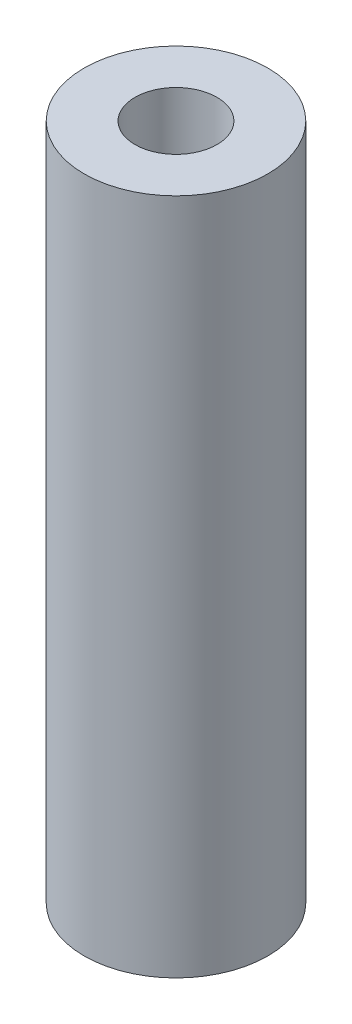
ISO-10303-21;
HEADER;
FILE_DESCRIPTION(('STEP AP214'),'2;1');
FILE_NAME('part.step','',(''),(''),'','','');
FILE_SCHEMA(('AUTOMOTIVE_DESIGN { 1 0 10303 214 1 1 1 1 }'));
ENDSEC;
DATA;
#1=APPLICATION_CONTEXT('core data for automotive mechanical design processes');
#2=APPLICATION_PROTOCOL_DEFINITION('international standard','automotive_design',2000,#1);
#3=PRODUCT_CONTEXT('',#1,'mechanical');
#4=PRODUCT('Part','Part','',(#3));
#5=PRODUCT_RELATED_PRODUCT_CATEGORY('part','',(#4));
#6=PRODUCT_DEFINITION_FORMATION('','',#4);
#7=PRODUCT_DEFINITION_CONTEXT('part definition',#1,'design');
#8=PRODUCT_DEFINITION('design','',#6,#7);
#9=PRODUCT_DEFINITION_SHAPE('','',#8);
#10=(LENGTH_UNIT() NAMED_UNIT(*) SI_UNIT(.MILLI.,.METRE.));
#11=(NAMED_UNIT(*) PLANE_ANGLE_UNIT() SI_UNIT($,.RADIAN.));
#12=(NAMED_UNIT(*) SI_UNIT($,.STERADIAN.) SOLID_ANGLE_UNIT());
#13=UNCERTAINTY_MEASURE_WITH_UNIT(LENGTH_MEASURE(1.E-05),#10,'distance_accuracy_value','');
#14=(GEOMETRIC_REPRESENTATION_CONTEXT(3) GLOBAL_UNCERTAINTY_ASSIGNED_CONTEXT((#13)) GLOBAL_UNIT_ASSIGNED_CONTEXT((#10,
#11,#12)) REPRESENTATION_CONTEXT('',''));
#15=CARTESIAN_POINT('',(0.,0.,0.));
#16=DIRECTION('',(0.,0.,1.));
#17=DIRECTION('',(1.,0.,0.));
#18=AXIS2_PLACEMENT_3D('',#15,#16,#17);
#19=CARTESIAN_POINT('',(0.,80.,0.));
#20=DIRECTION('',(0.,1.,0.));
#21=DIRECTION('',(0.,0.,1.));
#22=AXIS2_PLACEMENT_3D('',#19,#20,#21);
#23=PLANE('',#22);
#24=CARTESIAN_POINT('',(0.,80.,0.));
#25=DIRECTION('',(0.,1.,0.));
#26=DIRECTION('',(0.,0.,1.));
#27=AXIS2_PLACEMENT_3D('',#24,#25,#26);
#28=CIRCLE('',#27,10.8404002201047);
#29=CARTESIAN_POINT('',(0.,80.,10.8404002201047));
#30=VERTEX_POINT('',#29);
#31=EDGE_CURVE('E10',#30,#30,#28,.T.);
#32=ORIENTED_EDGE('',*,*,#31,.T.);
#33=EDGE_LOOP('',(#32));
#34=FACE_BOUND('',#33,.T.);
#35=CARTESIAN_POINT('',(0.,80.,0.));
#36=DIRECTION('',(0.,1.,0.));
#37=DIRECTION('',(0.,0.,1.));
#38=AXIS2_PLACEMENT_3D('',#35,#36,#37);
#39=CIRCLE('',#38,4.84040022010471);
#40=CARTESIAN_POINT('',(0.,80.,4.84040022010471));
#41=VERTEX_POINT('',#40);
#42=EDGE_CURVE('E41',#41,#41,#39,.T.);
#43=ORIENTED_EDGE('',*,*,#42,.F.);
#44=EDGE_LOOP('',(#43));
#45=FACE_BOUND('',#44,.T.);
#46=ADVANCED_FACE('F30',(#34,#45),#23,.T.);
#47=CARTESIAN_POINT('',(0.,0.,0.));
#48=DIRECTION('',(0.,1.,0.));
#49=DIRECTION('',(0.,0.,1.));
#50=AXIS2_PLACEMENT_3D('',#47,#48,#49);
#51=PLANE('',#50);
#52=CARTESIAN_POINT('',(0.,0.,0.));
#53=DIRECTION('',(0.,1.,0.));
#54=DIRECTION('',(0.,0.,1.));
#55=AXIS2_PLACEMENT_3D('',#52,#53,#54);
#56=CIRCLE('',#55,10.8404002201047);
#57=CARTESIAN_POINT('',(0.,0.,10.8404002201047));
#58=VERTEX_POINT('',#57);
#59=EDGE_CURVE('E34',#58,#58,#56,.T.);
#60=ORIENTED_EDGE('',*,*,#59,.F.);
#61=EDGE_LOOP('',(#60));
#62=FACE_BOUND('',#61,.T.);
#63=CARTESIAN_POINT('',(0.,0.,0.));
#64=DIRECTION('',(0.,1.,0.));
#65=DIRECTION('',(0.,0.,1.));
#66=AXIS2_PLACEMENT_3D('',#63,#64,#65);
#67=CIRCLE('',#66,4.84040022010471);
#68=CARTESIAN_POINT('',(0.,0.,4.84040022010471));
#69=VERTEX_POINT('',#68);
#70=EDGE_CURVE('E43',#69,#69,#67,.T.);
#71=ORIENTED_EDGE('',*,*,#70,.T.);
#72=EDGE_LOOP('',(#71));
#73=FACE_BOUND('',#72,.T.);
#74=ADVANCED_FACE('F53',(#62,#73),#51,.F.);
#75=CARTESIAN_POINT('',(0.,80.,0.));
#76=DIRECTION('',(0.,-1.,0.));
#77=DIRECTION('',(0.,0.,-1.));
#78=AXIS2_PLACEMENT_3D('',#75,#76,#77);
#79=CYLINDRICAL_SURFACE('',#78,10.8404002201047);
#80=ORIENTED_EDGE('',*,*,#31,.F.);
#81=EDGE_LOOP('',(#80));
#82=FACE_BOUND('',#81,.T.);
#83=ORIENTED_EDGE('',*,*,#59,.T.);
#84=EDGE_LOOP('',(#83));
#85=FACE_BOUND('',#84,.T.);
#86=ADVANCED_FACE('F32',(#82,#85),#79,.T.);
#87=CARTESIAN_POINT('',(0.,80.,0.));
#88=DIRECTION('',(0.,-1.,0.));
#89=DIRECTION('',(0.,0.,-1.));
#90=AXIS2_PLACEMENT_3D('',#87,#88,#89);
#91=CYLINDRICAL_SURFACE('',#90,4.84040022010471);
#92=ORIENTED_EDGE('',*,*,#42,.T.);
#93=EDGE_LOOP('',(#92));
#94=FACE_BOUND('',#93,.T.);
#95=ORIENTED_EDGE('',*,*,#70,.F.);
#96=EDGE_LOOP('',(#95));
#97=FACE_BOUND('',#96,.T.);
#98=ADVANCED_FACE('F49',(#94,#97),#91,.F.);
#99=CLOSED_SHELL('',(#46,#74,#86,#98));
#100=MANIFOLD_SOLID_BREP('B2',#99);
#101=ADVANCED_BREP_SHAPE_REPRESENTATION('',(#18,#100),#14);
#102=SHAPE_DEFINITION_REPRESENTATION(#9,#101);
ENDSEC;
END-ISO-10303-21;
